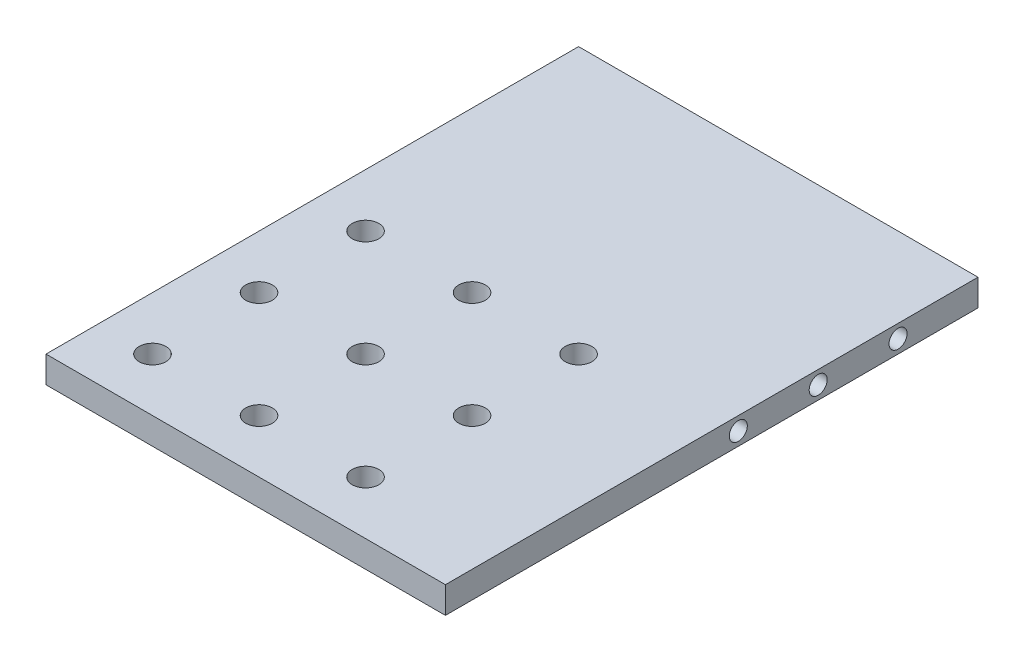
ISO-10303-21;
HEADER;
FILE_DESCRIPTION(('STEP AP214'),'2;1');
FILE_NAME('part.step','',(''),(''),'','','');
FILE_SCHEMA(('AUTOMOTIVE_DESIGN { 1 0 10303 214 1 1 1 1 }'));
ENDSEC;
DATA;
#1=APPLICATION_CONTEXT('core data for automotive mechanical design processes');
#2=APPLICATION_PROTOCOL_DEFINITION('international standard','automotive_design',2000,#1);
#3=PRODUCT_CONTEXT('',#1,'mechanical');
#4=PRODUCT('Part','Part','',(#3));
#5=PRODUCT_RELATED_PRODUCT_CATEGORY('part','',(#4));
#6=PRODUCT_DEFINITION_FORMATION('','',#4);
#7=PRODUCT_DEFINITION_CONTEXT('part definition',#1,'design');
#8=PRODUCT_DEFINITION('design','',#6,#7);
#9=PRODUCT_DEFINITION_SHAPE('','',#8);
#10=(LENGTH_UNIT() NAMED_UNIT(*) SI_UNIT(.MILLI.,.METRE.));
#11=(NAMED_UNIT(*) PLANE_ANGLE_UNIT() SI_UNIT($,.RADIAN.));
#12=(NAMED_UNIT(*) SI_UNIT($,.STERADIAN.) SOLID_ANGLE_UNIT());
#13=UNCERTAINTY_MEASURE_WITH_UNIT(LENGTH_MEASURE(1.E-05),#10,'distance_accuracy_value','');
#14=(GEOMETRIC_REPRESENTATION_CONTEXT(3) GLOBAL_UNCERTAINTY_ASSIGNED_CONTEXT((#13)) GLOBAL_UNIT_ASSIGNED_CONTEXT((#10,
#11,#12)) REPRESENTATION_CONTEXT('',''));
#15=CARTESIAN_POINT('',(0.,0.,0.));
#16=DIRECTION('',(0.,0.,1.));
#17=DIRECTION('',(1.,0.,0.));
#18=AXIS2_PLACEMENT_3D('',#15,#16,#17);
#19=CARTESIAN_POINT('',(0.,6.35,0.));
#20=DIRECTION('',(0.,-1.,0.));
#21=DIRECTION('',(0.,0.,-1.));
#22=AXIS2_PLACEMENT_3D('',#19,#20,#21);
#23=PLANE('',#22);
#24=DIRECTION('',(1.,0.,0.));
#25=VECTOR('',#24,1.);
#26=CARTESIAN_POINT('',(-47.625,6.35,63.5));
#27=LINE('',#26,#25);
#28=CARTESIAN_POINT('',(-47.625,6.35,63.5));
#29=VERTEX_POINT('',#28);
#30=CARTESIAN_POINT('',(47.625,6.35,63.5));
#31=VERTEX_POINT('',#30);
#32=EDGE_CURVE('E85',#29,#31,#27,.T.);
#33=ORIENTED_EDGE('',*,*,#32,.T.);
#34=DIRECTION('',(0.,0.,-1.));
#35=VECTOR('',#34,1.);
#36=CARTESIAN_POINT('',(47.625,6.35,-63.5));
#37=LINE('',#36,#35);
#38=CARTESIAN_POINT('',(47.625,6.35,-63.5));
#39=VERTEX_POINT('',#38);
#40=EDGE_CURVE('E80',#31,#39,#37,.T.);
#41=ORIENTED_EDGE('',*,*,#40,.T.);
#42=DIRECTION('',(-1.,0.,0.));
#43=VECTOR('',#42,1.);
#44=CARTESIAN_POINT('',(-47.625,6.35,-63.5));
#45=LINE('',#44,#43);
#46=CARTESIAN_POINT('',(-47.625,6.35,-63.5));
#47=VERTEX_POINT('',#46);
#48=EDGE_CURVE('E83',#39,#47,#45,.T.);
#49=ORIENTED_EDGE('',*,*,#48,.T.);
#50=DIRECTION('',(0.,0.,1.));
#51=VECTOR('',#50,1.);
#52=CARTESIAN_POINT('',(-47.625,6.35,-63.5));
#53=LINE('',#52,#51);
#54=EDGE_CURVE('E50',#47,#29,#53,.T.);
#55=ORIENTED_EDGE('',*,*,#54,.T.);
#56=EDGE_LOOP('',(#33,#41,#49,#55));
#57=FACE_BOUND('',#56,.T.);
#58=CARTESIAN_POINT('',(-34.925,6.35,0.));
#59=DIRECTION('',(0.,1.,0.));
#60=DIRECTION('',(0.,0.,1.));
#61=AXIS2_PLACEMENT_3D('',#58,#59,#60);
#62=CIRCLE('',#61,3.175);
#63=CARTESIAN_POINT('',(-34.925,6.35,3.17500000000001));
#64=VERTEX_POINT('',#63);
#65=EDGE_CURVE('E100',#64,#64,#62,.T.);
#66=ORIENTED_EDGE('',*,*,#65,.F.);
#67=EDGE_LOOP('',(#66));
#68=FACE_BOUND('',#67,.T.);
#69=CARTESIAN_POINT('',(-9.52499999999999,6.35,0.));
#70=DIRECTION('',(0.,1.,0.));
#71=DIRECTION('',(0.,0.,1.));
#72=AXIS2_PLACEMENT_3D('',#69,#70,#71);
#73=CIRCLE('',#72,3.175);
#74=CARTESIAN_POINT('',(-9.52499999999999,6.35,3.17500000000001));
#75=VERTEX_POINT('',#74);
#76=EDGE_CURVE('E115',#75,#75,#73,.T.);
#77=ORIENTED_EDGE('',*,*,#76,.F.);
#78=EDGE_LOOP('',(#77));
#79=FACE_BOUND('',#78,.T.);
#80=CARTESIAN_POINT('',(15.875,6.35,0.));
#81=DIRECTION('',(0.,1.,0.));
#82=DIRECTION('',(0.,0.,1.));
#83=AXIS2_PLACEMENT_3D('',#80,#81,#82);
#84=CIRCLE('',#83,3.175);
#85=CARTESIAN_POINT('',(15.875,6.35,3.17500000000001));
#86=VERTEX_POINT('',#85);
#87=EDGE_CURVE('E121',#86,#86,#84,.T.);
#88=ORIENTED_EDGE('',*,*,#87,.F.);
#89=EDGE_LOOP('',(#88));
#90=FACE_BOUND('',#89,.T.);
#91=CARTESIAN_POINT('',(-9.52499999999973,6.35,25.4));
#92=DIRECTION('',(0.,1.,0.));
#93=DIRECTION('',(0.,0.,1.));
#94=AXIS2_PLACEMENT_3D('',#91,#92,#93);
#95=CIRCLE('',#94,3.175);
#96=CARTESIAN_POINT('',(-9.52499999999973,6.35,28.575));
#97=VERTEX_POINT('',#96);
#98=EDGE_CURVE('E127',#97,#97,#95,.T.);
#99=ORIENTED_EDGE('',*,*,#98,.F.);
#100=EDGE_LOOP('',(#99));
#101=FACE_BOUND('',#100,.T.);
#102=CARTESIAN_POINT('',(15.8750000000003,6.35,25.4));
#103=DIRECTION('',(0.,1.,0.));
#104=DIRECTION('',(0.,0.,1.));
#105=AXIS2_PLACEMENT_3D('',#102,#103,#104);
#106=CIRCLE('',#105,3.175);
#107=CARTESIAN_POINT('',(15.8750000000003,6.35,28.575));
#108=VERTEX_POINT('',#107);
#109=EDGE_CURVE('E133',#108,#108,#106,.T.);
#110=ORIENTED_EDGE('',*,*,#109,.F.);
#111=EDGE_LOOP('',(#110));
#112=FACE_BOUND('',#111,.T.);
#113=CARTESIAN_POINT('',(-9.52499999999946,6.35,50.8));
#114=DIRECTION('',(0.,1.,0.));
#115=DIRECTION('',(0.,0.,1.));
#116=AXIS2_PLACEMENT_3D('',#113,#114,#115);
#117=CIRCLE('',#116,3.175);
#118=CARTESIAN_POINT('',(-9.52499999999946,6.35,53.975));
#119=VERTEX_POINT('',#118);
#120=EDGE_CURVE('E139',#119,#119,#117,.T.);
#121=ORIENTED_EDGE('',*,*,#120,.F.);
#122=EDGE_LOOP('',(#121));
#123=FACE_BOUND('',#122,.T.);
#124=CARTESIAN_POINT('',(15.8750000000005,6.35,50.8));
#125=DIRECTION('',(0.,1.,0.));
#126=DIRECTION('',(0.,0.,1.));
#127=AXIS2_PLACEMENT_3D('',#124,#125,#126);
#128=CIRCLE('',#127,3.175);
#129=CARTESIAN_POINT('',(15.8750000000005,6.35,53.975));
#130=VERTEX_POINT('',#129);
#131=EDGE_CURVE('E145',#130,#130,#128,.T.);
#132=ORIENTED_EDGE('',*,*,#131,.F.);
#133=EDGE_LOOP('',(#132));
#134=FACE_BOUND('',#133,.T.);
#135=CARTESIAN_POINT('',(-34.9249999999997,6.35,25.4));
#136=DIRECTION('',(0.,1.,0.));
#137=DIRECTION('',(0.,0.,1.));
#138=AXIS2_PLACEMENT_3D('',#135,#136,#137);
#139=CIRCLE('',#138,3.175);
#140=CARTESIAN_POINT('',(-34.9249999999997,6.35,28.575));
#141=VERTEX_POINT('',#140);
#142=EDGE_CURVE('E151',#141,#141,#139,.T.);
#143=ORIENTED_EDGE('',*,*,#142,.F.);
#144=EDGE_LOOP('',(#143));
#145=FACE_BOUND('',#144,.T.);
#146=CARTESIAN_POINT('',(-34.9249999999995,6.35,50.8));
#147=DIRECTION('',(0.,1.,0.));
#148=DIRECTION('',(0.,0.,1.));
#149=AXIS2_PLACEMENT_3D('',#146,#147,#148);
#150=CIRCLE('',#149,3.175);
#151=CARTESIAN_POINT('',(-34.9249999999995,6.35,53.975));
#152=VERTEX_POINT('',#151);
#153=EDGE_CURVE('E157',#152,#152,#150,.T.);
#154=ORIENTED_EDGE('',*,*,#153,.F.);
#155=EDGE_LOOP('',(#154));
#156=FACE_BOUND('',#155,.T.);
#157=ADVANCED_FACE('F33',(#57,#68,#79,#90,#101,#112,#123,#134,#145,#156),#23,.F.);
#158=CARTESIAN_POINT('',(0.,0.,0.));
#159=DIRECTION('',(0.,-1.,0.));
#160=DIRECTION('',(0.,0.,-1.));
#161=AXIS2_PLACEMENT_3D('',#158,#159,#160);
#162=PLANE('',#161);
#163=CARTESIAN_POINT('',(-34.9249999999997,0.,25.4));
#164=DIRECTION('',(0.,1.,0.));
#165=DIRECTION('',(0.,0.,1.));
#166=AXIS2_PLACEMENT_3D('',#163,#164,#165);
#167=CIRCLE('',#166,3.175);
#168=CARTESIAN_POINT('',(-34.9249999999997,0.,28.575));
#169=VERTEX_POINT('',#168);
#170=EDGE_CURVE('E154',#169,#169,#167,.T.);
#171=ORIENTED_EDGE('',*,*,#170,.T.);
#172=EDGE_LOOP('',(#171));
#173=FACE_BOUND('',#172,.T.);
#174=CARTESIAN_POINT('',(-9.52499999999946,0.,50.8));
#175=DIRECTION('',(0.,1.,0.));
#176=DIRECTION('',(0.,0.,1.));
#177=AXIS2_PLACEMENT_3D('',#174,#175,#176);
#178=CIRCLE('',#177,3.175);
#179=CARTESIAN_POINT('',(-9.52499999999946,0.,53.975));
#180=VERTEX_POINT('',#179);
#181=EDGE_CURVE('E142',#180,#180,#178,.T.);
#182=ORIENTED_EDGE('',*,*,#181,.T.);
#183=EDGE_LOOP('',(#182));
#184=FACE_BOUND('',#183,.T.);
#185=CARTESIAN_POINT('',(-9.52499999999973,0.,25.4));
#186=DIRECTION('',(0.,1.,0.));
#187=DIRECTION('',(0.,0.,1.));
#188=AXIS2_PLACEMENT_3D('',#185,#186,#187);
#189=CIRCLE('',#188,3.175);
#190=CARTESIAN_POINT('',(-9.52499999999973,0.,28.575));
#191=VERTEX_POINT('',#190);
#192=EDGE_CURVE('E130',#191,#191,#189,.T.);
#193=ORIENTED_EDGE('',*,*,#192,.T.);
#194=EDGE_LOOP('',(#193));
#195=FACE_BOUND('',#194,.T.);
#196=CARTESIAN_POINT('',(-9.52499999999999,0.,0.));
#197=DIRECTION('',(0.,1.,0.));
#198=DIRECTION('',(0.,0.,1.));
#199=AXIS2_PLACEMENT_3D('',#196,#197,#198);
#200=CIRCLE('',#199,3.175);
#201=CARTESIAN_POINT('',(-9.52499999999999,0.,3.17500000000001));
#202=VERTEX_POINT('',#201);
#203=EDGE_CURVE('E118',#202,#202,#200,.T.);
#204=ORIENTED_EDGE('',*,*,#203,.T.);
#205=EDGE_LOOP('',(#204));
#206=FACE_BOUND('',#205,.T.);
#207=DIRECTION('',(1.,0.,0.));
#208=VECTOR('',#207,1.);
#209=CARTESIAN_POINT('',(-47.625,0.,63.5));
#210=LINE('',#209,#208);
#211=CARTESIAN_POINT('',(-47.625,0.,63.5));
#212=VERTEX_POINT('',#211);
#213=CARTESIAN_POINT('',(47.625,0.,63.5));
#214=VERTEX_POINT('',#213);
#215=EDGE_CURVE('E97',#212,#214,#210,.T.);
#216=ORIENTED_EDGE('',*,*,#215,.F.);
#217=DIRECTION('',(0.,0.,1.));
#218=VECTOR('',#217,1.);
#219=CARTESIAN_POINT('',(-47.625,0.,-63.5));
#220=LINE('',#219,#218);
#221=CARTESIAN_POINT('',(-47.625,0.,-63.5));
#222=VERTEX_POINT('',#221);
#223=EDGE_CURVE('E73',#222,#212,#220,.T.);
#224=ORIENTED_EDGE('',*,*,#223,.F.);
#225=DIRECTION('',(-1.,0.,0.));
#226=VECTOR('',#225,1.);
#227=CARTESIAN_POINT('',(-47.625,0.,-63.5));
#228=LINE('',#227,#226);
#229=CARTESIAN_POINT('',(47.625,0.,-63.5));
#230=VERTEX_POINT('',#229);
#231=EDGE_CURVE('E67',#230,#222,#228,.T.);
#232=ORIENTED_EDGE('',*,*,#231,.F.);
#233=DIRECTION('',(0.,0.,-1.));
#234=VECTOR('',#233,1.);
#235=CARTESIAN_POINT('',(47.625,0.,-63.5));
#236=LINE('',#235,#234);
#237=EDGE_CURVE('E89',#214,#230,#236,.T.);
#238=ORIENTED_EDGE('',*,*,#237,.F.);
#239=EDGE_LOOP('',(#216,#224,#232,#238));
#240=FACE_BOUND('',#239,.T.);
#241=CARTESIAN_POINT('',(-34.925,0.,0.));
#242=DIRECTION('',(0.,1.,0.));
#243=DIRECTION('',(0.,0.,1.));
#244=AXIS2_PLACEMENT_3D('',#241,#242,#243);
#245=CIRCLE('',#244,3.175);
#246=CARTESIAN_POINT('',(-34.925,0.,3.17500000000001));
#247=VERTEX_POINT('',#246);
#248=EDGE_CURVE('E112',#247,#247,#245,.T.);
#249=ORIENTED_EDGE('',*,*,#248,.T.);
#250=EDGE_LOOP('',(#249));
#251=FACE_BOUND('',#250,.T.);
#252=CARTESIAN_POINT('',(15.875,0.,0.));
#253=DIRECTION('',(0.,1.,0.));
#254=DIRECTION('',(0.,0.,1.));
#255=AXIS2_PLACEMENT_3D('',#252,#253,#254);
#256=CIRCLE('',#255,3.175);
#257=CARTESIAN_POINT('',(15.875,0.,3.17500000000001));
#258=VERTEX_POINT('',#257);
#259=EDGE_CURVE('E124',#258,#258,#256,.T.);
#260=ORIENTED_EDGE('',*,*,#259,.T.);
#261=EDGE_LOOP('',(#260));
#262=FACE_BOUND('',#261,.T.);
#263=CARTESIAN_POINT('',(15.8750000000003,0.,25.4));
#264=DIRECTION('',(0.,1.,0.));
#265=DIRECTION('',(0.,0.,1.));
#266=AXIS2_PLACEMENT_3D('',#263,#264,#265);
#267=CIRCLE('',#266,3.175);
#268=CARTESIAN_POINT('',(15.8750000000003,0.,28.575));
#269=VERTEX_POINT('',#268);
#270=EDGE_CURVE('E136',#269,#269,#267,.T.);
#271=ORIENTED_EDGE('',*,*,#270,.T.);
#272=EDGE_LOOP('',(#271));
#273=FACE_BOUND('',#272,.T.);
#274=CARTESIAN_POINT('',(15.8750000000005,0.,50.8));
#275=DIRECTION('',(0.,1.,0.));
#276=DIRECTION('',(0.,0.,1.));
#277=AXIS2_PLACEMENT_3D('',#274,#275,#276);
#278=CIRCLE('',#277,3.175);
#279=CARTESIAN_POINT('',(15.8750000000005,0.,53.975));
#280=VERTEX_POINT('',#279);
#281=EDGE_CURVE('E148',#280,#280,#278,.T.);
#282=ORIENTED_EDGE('',*,*,#281,.T.);
#283=EDGE_LOOP('',(#282));
#284=FACE_BOUND('',#283,.T.);
#285=CARTESIAN_POINT('',(-34.9249999999995,0.,50.8));
#286=DIRECTION('',(0.,1.,0.));
#287=DIRECTION('',(0.,0.,1.));
#288=AXIS2_PLACEMENT_3D('',#285,#286,#287);
#289=CIRCLE('',#288,3.175);
#290=CARTESIAN_POINT('',(-34.9249999999995,0.,53.975));
#291=VERTEX_POINT('',#290);
#292=EDGE_CURVE('E160',#291,#291,#289,.T.);
#293=ORIENTED_EDGE('',*,*,#292,.T.);
#294=EDGE_LOOP('',(#293));
#295=FACE_BOUND('',#294,.T.);
#296=ADVANCED_FACE('F108',(#173,#184,#195,#206,#240,#251,#262,#273,#284,#295),#162,.T.);
#297=CARTESIAN_POINT('',(-47.625,6.35,63.5));
#298=DIRECTION('',(0.,0.,-1.));
#299=DIRECTION('',(-1.,0.,0.));
#300=AXIS2_PLACEMENT_3D('',#297,#298,#299);
#301=PLANE('',#300);
#302=ORIENTED_EDGE('',*,*,#215,.T.);
#303=DIRECTION('',(0.,-1.,0.));
#304=VECTOR('',#303,1.);
#305=CARTESIAN_POINT('',(47.625,6.35,63.5));
#306=LINE('',#305,#304);
#307=EDGE_CURVE('E11',#31,#214,#306,.T.);
#308=ORIENTED_EDGE('',*,*,#307,.F.);
#309=ORIENTED_EDGE('',*,*,#32,.F.);
#310=DIRECTION('',(0.,-1.,0.));
#311=VECTOR('',#310,1.);
#312=CARTESIAN_POINT('',(-47.625,6.35,63.5));
#313=LINE('',#312,#311);
#314=EDGE_CURVE('E93',#29,#212,#313,.T.);
#315=ORIENTED_EDGE('',*,*,#314,.T.);
#316=EDGE_LOOP('',(#302,#308,#309,#315));
#317=FACE_BOUND('',#316,.T.);
#318=ADVANCED_FACE('F35',(#317),#301,.F.);
#319=CARTESIAN_POINT('',(47.625,6.35,-63.5));
#320=DIRECTION('',(-1.,0.,0.));
#321=DIRECTION('',(0.,0.,1.));
#322=AXIS2_PLACEMENT_3D('',#319,#320,#321);
#323=PLANE('',#322);
#324=CARTESIAN_POINT('',(47.625,3.17499999999987,-25.39238));
#325=DIRECTION('',(1.,0.,0.));
#326=DIRECTION('',(0.,0.,-1.));
#327=AXIS2_PLACEMENT_3D('',#324,#325,#326);
#328=CIRCLE('',#327,2.15265);
#329=CARTESIAN_POINT('',(47.625,3.17499999999987,-27.54503));
#330=VERTEX_POINT('',#329);
#331=EDGE_CURVE('E178',#330,#330,#328,.T.);
#332=ORIENTED_EDGE('',*,*,#331,.F.);
#333=EDGE_LOOP('',(#332));
#334=FACE_BOUND('',#333,.T.);
#335=CARTESIAN_POINT('',(47.625,3.17499999999973,-6.34238));
#336=DIRECTION('',(1.,0.,0.));
#337=DIRECTION('',(0.,0.,-1.));
#338=AXIS2_PLACEMENT_3D('',#335,#336,#337);
#339=CIRCLE('',#338,2.15265);
#340=CARTESIAN_POINT('',(47.625,3.17499999999973,-8.49503));
#341=VERTEX_POINT('',#340);
#342=EDGE_CURVE('E172',#341,#341,#339,.T.);
#343=ORIENTED_EDGE('',*,*,#342,.F.);
#344=EDGE_LOOP('',(#343));
#345=FACE_BOUND('',#344,.T.);
#346=CARTESIAN_POINT('',(47.625,3.175,-44.44238));
#347=DIRECTION('',(1.,0.,0.));
#348=DIRECTION('',(0.,0.,-1.));
#349=AXIS2_PLACEMENT_3D('',#346,#347,#348);
#350=CIRCLE('',#349,2.15265000000001);
#351=CARTESIAN_POINT('',(47.625,3.175,-46.59503));
#352=VERTEX_POINT('',#351);
#353=EDGE_CURVE('E166',#352,#352,#350,.T.);
#354=ORIENTED_EDGE('',*,*,#353,.F.);
#355=EDGE_LOOP('',(#354));
#356=FACE_BOUND('',#355,.T.);
#357=ORIENTED_EDGE('',*,*,#237,.T.);
#358=DIRECTION('',(0.,-1.,0.));
#359=VECTOR('',#358,1.);
#360=CARTESIAN_POINT('',(47.625,6.35,-63.5));
#361=LINE('',#360,#359);
#362=EDGE_CURVE('E42',#39,#230,#361,.T.);
#363=ORIENTED_EDGE('',*,*,#362,.F.);
#364=ORIENTED_EDGE('',*,*,#40,.F.);
#365=ORIENTED_EDGE('',*,*,#307,.T.);
#366=EDGE_LOOP('',(#357,#363,#364,#365));
#367=FACE_BOUND('',#366,.T.);
#368=ADVANCED_FACE('F88',(#334,#345,#356,#367),#323,.F.);
#369=CARTESIAN_POINT('',(-47.625,6.35,-63.5));
#370=DIRECTION('',(0.,0.,1.));
#371=DIRECTION('',(1.,0.,0.));
#372=AXIS2_PLACEMENT_3D('',#369,#370,#371);
#373=PLANE('',#372);
#374=ORIENTED_EDGE('',*,*,#231,.T.);
#375=DIRECTION('',(0.,-1.,0.));
#376=VECTOR('',#375,1.);
#377=CARTESIAN_POINT('',(-47.625,6.35,-63.5));
#378=LINE('',#377,#376);
#379=EDGE_CURVE('E90',#47,#222,#378,.T.);
#380=ORIENTED_EDGE('',*,*,#379,.F.);
#381=ORIENTED_EDGE('',*,*,#48,.F.);
#382=ORIENTED_EDGE('',*,*,#362,.T.);
#383=EDGE_LOOP('',(#374,#380,#381,#382));
#384=FACE_BOUND('',#383,.T.);
#385=ADVANCED_FACE('F91',(#384),#373,.F.);
#386=CARTESIAN_POINT('',(-47.625,6.35,-63.5));
#387=DIRECTION('',(1.,0.,0.));
#388=DIRECTION('',(0.,0.,-1.));
#389=AXIS2_PLACEMENT_3D('',#386,#387,#388);
#390=PLANE('',#389);
#391=ORIENTED_EDGE('',*,*,#223,.T.);
#392=ORIENTED_EDGE('',*,*,#314,.F.);
#393=ORIENTED_EDGE('',*,*,#54,.F.);
#394=ORIENTED_EDGE('',*,*,#379,.T.);
#395=EDGE_LOOP('',(#391,#392,#393,#394));
#396=FACE_BOUND('',#395,.T.);
#397=ADVANCED_FACE('F105',(#396),#390,.F.);
#398=CARTESIAN_POINT('',(-34.925,6.35,0.));
#399=DIRECTION('',(0.,-1.,0.));
#400=DIRECTION('',(0.,0.,-1.));
#401=AXIS2_PLACEMENT_3D('',#398,#399,#400);
#402=CYLINDRICAL_SURFACE('',#401,3.175);
#403=ORIENTED_EDGE('',*,*,#65,.T.);
#404=EDGE_LOOP('',(#403));
#405=FACE_BOUND('',#404,.T.);
#406=ORIENTED_EDGE('',*,*,#248,.F.);
#407=EDGE_LOOP('',(#406));
#408=FACE_BOUND('',#407,.T.);
#409=ADVANCED_FACE('F224',(#405,#408),#402,.F.);
#410=CARTESIAN_POINT('',(-9.52499999999999,6.35,0.));
#411=DIRECTION('',(0.,-1.,0.));
#412=DIRECTION('',(0.,0.,-1.));
#413=AXIS2_PLACEMENT_3D('',#410,#411,#412);
#414=CYLINDRICAL_SURFACE('',#413,3.175);
#415=ORIENTED_EDGE('',*,*,#76,.T.);
#416=EDGE_LOOP('',(#415));
#417=FACE_BOUND('',#416,.T.);
#418=ORIENTED_EDGE('',*,*,#203,.F.);
#419=EDGE_LOOP('',(#418));
#420=FACE_BOUND('',#419,.T.);
#421=ADVANCED_FACE('F246',(#417,#420),#414,.F.);
#422=CARTESIAN_POINT('',(15.875,6.35,0.));
#423=DIRECTION('',(0.,-1.,0.));
#424=DIRECTION('',(0.,0.,-1.));
#425=AXIS2_PLACEMENT_3D('',#422,#423,#424);
#426=CYLINDRICAL_SURFACE('',#425,3.175);
#427=ORIENTED_EDGE('',*,*,#87,.T.);
#428=EDGE_LOOP('',(#427));
#429=FACE_BOUND('',#428,.T.);
#430=ORIENTED_EDGE('',*,*,#259,.F.);
#431=EDGE_LOOP('',(#430));
#432=FACE_BOUND('',#431,.T.);
#433=ADVANCED_FACE('F253',(#429,#432),#426,.F.);
#434=CARTESIAN_POINT('',(-9.52499999999973,6.35,25.4));
#435=DIRECTION('',(0.,-1.,0.));
#436=DIRECTION('',(0.,0.,-1.));
#437=AXIS2_PLACEMENT_3D('',#434,#435,#436);
#438=CYLINDRICAL_SURFACE('',#437,3.175);
#439=ORIENTED_EDGE('',*,*,#98,.T.);
#440=EDGE_LOOP('',(#439));
#441=FACE_BOUND('',#440,.T.);
#442=ORIENTED_EDGE('',*,*,#192,.F.);
#443=EDGE_LOOP('',(#442));
#444=FACE_BOUND('',#443,.T.);
#445=ADVANCED_FACE('F260',(#441,#444),#438,.F.);
#446=CARTESIAN_POINT('',(15.8750000000003,6.35,25.4));
#447=DIRECTION('',(0.,-1.,0.));
#448=DIRECTION('',(0.,0.,-1.));
#449=AXIS2_PLACEMENT_3D('',#446,#447,#448);
#450=CYLINDRICAL_SURFACE('',#449,3.175);
#451=ORIENTED_EDGE('',*,*,#109,.T.);
#452=EDGE_LOOP('',(#451));
#453=FACE_BOUND('',#452,.T.);
#454=ORIENTED_EDGE('',*,*,#270,.F.);
#455=EDGE_LOOP('',(#454));
#456=FACE_BOUND('',#455,.T.);
#457=ADVANCED_FACE('F268',(#453,#456),#450,.F.);
#458=CARTESIAN_POINT('',(-9.52499999999946,6.35,50.8));
#459=DIRECTION('',(0.,-1.,0.));
#460=DIRECTION('',(0.,0.,-1.));
#461=AXIS2_PLACEMENT_3D('',#458,#459,#460);
#462=CYLINDRICAL_SURFACE('',#461,3.175);
#463=ORIENTED_EDGE('',*,*,#120,.T.);
#464=EDGE_LOOP('',(#463));
#465=FACE_BOUND('',#464,.T.);
#466=ORIENTED_EDGE('',*,*,#181,.F.);
#467=EDGE_LOOP('',(#466));
#468=FACE_BOUND('',#467,.T.);
#469=ADVANCED_FACE('F276',(#465,#468),#462,.F.);
#470=CARTESIAN_POINT('',(15.8750000000005,6.35,50.8));
#471=DIRECTION('',(0.,-1.,0.));
#472=DIRECTION('',(0.,0.,-1.));
#473=AXIS2_PLACEMENT_3D('',#470,#471,#472);
#474=CYLINDRICAL_SURFACE('',#473,3.175);
#475=ORIENTED_EDGE('',*,*,#131,.T.);
#476=EDGE_LOOP('',(#475));
#477=FACE_BOUND('',#476,.T.);
#478=ORIENTED_EDGE('',*,*,#281,.F.);
#479=EDGE_LOOP('',(#478));
#480=FACE_BOUND('',#479,.T.);
#481=ADVANCED_FACE('F284',(#477,#480),#474,.F.);
#482=CARTESIAN_POINT('',(-34.9249999999997,6.35,25.4));
#483=DIRECTION('',(0.,-1.,0.));
#484=DIRECTION('',(0.,0.,-1.));
#485=AXIS2_PLACEMENT_3D('',#482,#483,#484);
#486=CYLINDRICAL_SURFACE('',#485,3.175);
#487=ORIENTED_EDGE('',*,*,#142,.T.);
#488=EDGE_LOOP('',(#487));
#489=FACE_BOUND('',#488,.T.);
#490=ORIENTED_EDGE('',*,*,#170,.F.);
#491=EDGE_LOOP('',(#490));
#492=FACE_BOUND('',#491,.T.);
#493=ADVANCED_FACE('F212',(#489,#492),#486,.F.);
#494=CARTESIAN_POINT('',(-34.9249999999995,6.35,50.8));
#495=DIRECTION('',(0.,-1.,0.));
#496=DIRECTION('',(0.,0.,-1.));
#497=AXIS2_PLACEMENT_3D('',#494,#495,#496);
#498=CYLINDRICAL_SURFACE('',#497,3.175);
#499=ORIENTED_EDGE('',*,*,#153,.T.);
#500=EDGE_LOOP('',(#499));
#501=FACE_BOUND('',#500,.T.);
#502=ORIENTED_EDGE('',*,*,#292,.F.);
#503=EDGE_LOOP('',(#502));
#504=FACE_BOUND('',#503,.T.);
#505=ADVANCED_FACE('F202',(#501,#504),#498,.F.);
#506=CARTESIAN_POINT('',(22.225,3.175,-44.44238));
#507=DIRECTION('',(1.,0.,0.));
#508=DIRECTION('',(0.,0.,-1.));
#509=AXIS2_PLACEMENT_3D('',#506,#507,#508);
#510=CYLINDRICAL_SURFACE('',#509,2.15265000000001);
#511=CARTESIAN_POINT('',(22.225,3.175,-44.44238));
#512=DIRECTION('',(1.,0.,0.));
#513=DIRECTION('',(0.,0.,-1.));
#514=AXIS2_PLACEMENT_3D('',#511,#512,#513);
#515=CIRCLE('',#514,2.15265000000001);
#516=CARTESIAN_POINT('',(22.225,3.175,-46.59503));
#517=VERTEX_POINT('',#516);
#518=EDGE_CURVE('E163',#517,#517,#515,.T.);
#519=ORIENTED_EDGE('',*,*,#518,.F.);
#520=EDGE_LOOP('',(#519));
#521=FACE_BOUND('',#520,.T.);
#522=ORIENTED_EDGE('',*,*,#353,.T.);
#523=EDGE_LOOP('',(#522));
#524=FACE_BOUND('',#523,.T.);
#525=ADVANCED_FACE('F199',(#521,#524),#510,.F.);
#526=CARTESIAN_POINT('',(22.225,3.175,-44.44238));
#527=DIRECTION('',(1.,0.,0.));
#528=DIRECTION('',(0.,0.,-1.));
#529=AXIS2_PLACEMENT_3D('',#526,#527,#528);
#530=PLANE('',#529);
#531=ORIENTED_EDGE('',*,*,#518,.T.);
#532=EDGE_LOOP('',(#531));
#533=FACE_BOUND('',#532,.T.);
#534=ADVANCED_FACE('F201',(#533),#530,.T.);
#535=CARTESIAN_POINT('',(22.225,3.17499999999973,-6.34238));
#536=DIRECTION('',(1.,0.,0.));
#537=DIRECTION('',(0.,0.,-1.));
#538=AXIS2_PLACEMENT_3D('',#535,#536,#537);
#539=CYLINDRICAL_SURFACE('',#538,2.15265);
#540=CARTESIAN_POINT('',(22.225,3.17499999999973,-6.34238));
#541=DIRECTION('',(1.,0.,0.));
#542=DIRECTION('',(0.,0.,-1.));
#543=AXIS2_PLACEMENT_3D('',#540,#541,#542);
#544=CIRCLE('',#543,2.15265);
#545=CARTESIAN_POINT('',(22.225,3.17499999999973,-8.49503));
#546=VERTEX_POINT('',#545);
#547=EDGE_CURVE('E175',#546,#546,#544,.T.);
#548=ORIENTED_EDGE('',*,*,#547,.F.);
#549=EDGE_LOOP('',(#548));
#550=FACE_BOUND('',#549,.T.);
#551=ORIENTED_EDGE('',*,*,#342,.T.);
#552=EDGE_LOOP('',(#551));
#553=FACE_BOUND('',#552,.T.);
#554=ADVANCED_FACE('F209',(#550,#553),#539,.F.);
#555=CARTESIAN_POINT('',(22.225,3.17499999999973,-6.34238));
#556=DIRECTION('',(1.,0.,0.));
#557=DIRECTION('',(0.,0.,-1.));
#558=AXIS2_PLACEMENT_3D('',#555,#556,#557);
#559=PLANE('',#558);
#560=ORIENTED_EDGE('',*,*,#547,.T.);
#561=EDGE_LOOP('',(#560));
#562=FACE_BOUND('',#561,.T.);
#563=ADVANCED_FACE('F189',(#562),#559,.T.);
#564=CARTESIAN_POINT('',(22.225,3.17499999999987,-25.39238));
#565=DIRECTION('',(1.,0.,0.));
#566=DIRECTION('',(0.,0.,-1.));
#567=AXIS2_PLACEMENT_3D('',#564,#565,#566);
#568=CYLINDRICAL_SURFACE('',#567,2.15265);
#569=CARTESIAN_POINT('',(22.225,3.17499999999987,-25.39238));
#570=DIRECTION('',(1.,0.,0.));
#571=DIRECTION('',(0.,0.,-1.));
#572=AXIS2_PLACEMENT_3D('',#569,#570,#571);
#573=CIRCLE('',#572,2.15265);
#574=CARTESIAN_POINT('',(22.225,3.17499999999987,-27.54503));
#575=VERTEX_POINT('',#574);
#576=EDGE_CURVE('E169',#575,#575,#573,.T.);
#577=ORIENTED_EDGE('',*,*,#576,.F.);
#578=EDGE_LOOP('',(#577));
#579=FACE_BOUND('',#578,.T.);
#580=ORIENTED_EDGE('',*,*,#331,.T.);
#581=EDGE_LOOP('',(#580));
#582=FACE_BOUND('',#581,.T.);
#583=ADVANCED_FACE('F186',(#579,#582),#568,.F.);
#584=CARTESIAN_POINT('',(22.225,3.17499999999987,-25.39238));
#585=DIRECTION('',(1.,0.,0.));
#586=DIRECTION('',(0.,0.,-1.));
#587=AXIS2_PLACEMENT_3D('',#584,#585,#586);
#588=PLANE('',#587);
#589=ORIENTED_EDGE('',*,*,#576,.T.);
#590=EDGE_LOOP('',(#589));
#591=FACE_BOUND('',#590,.T.);
#592=ADVANCED_FACE('F184',(#591),#588,.T.);
#593=CLOSED_SHELL('',(#157,#296,#318,#368,#385,#397,#409,#421,#433,#445,#457,#469,#481,#493,
#505,#525,#534,#554,#563,#583,#592));
#594=MANIFOLD_SOLID_BREP('B2',#593);
#595=ADVANCED_BREP_SHAPE_REPRESENTATION('',(#18,#594),#14);
#596=SHAPE_DEFINITION_REPRESENTATION(#9,#595);
ENDSEC;
END-ISO-10303-21;
